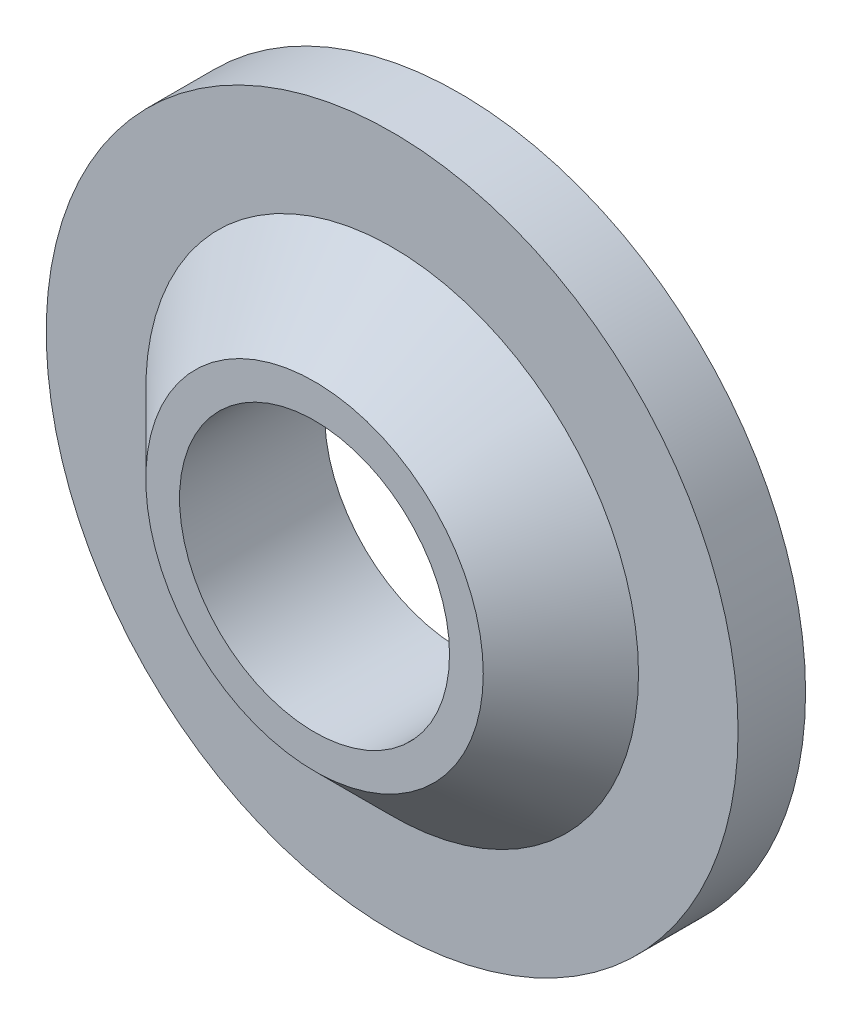
ISO-10303-21;
HEADER;
FILE_DESCRIPTION(('STEP AP214'),'2;1');
FILE_NAME('part.step','',(''),(''),'','','');
FILE_SCHEMA(('AUTOMOTIVE_DESIGN { 1 0 10303 214 1 1 1 1 }'));
ENDSEC;
DATA;
#1=APPLICATION_CONTEXT('core data for automotive mechanical design processes');
#2=APPLICATION_PROTOCOL_DEFINITION('international standard','automotive_design',2000,#1);
#3=PRODUCT_CONTEXT('',#1,'mechanical');
#4=PRODUCT('Part','Part','',(#3));
#5=PRODUCT_RELATED_PRODUCT_CATEGORY('part','',(#4));
#6=PRODUCT_DEFINITION_FORMATION('','',#4);
#7=PRODUCT_DEFINITION_CONTEXT('part definition',#1,'design');
#8=PRODUCT_DEFINITION('design','',#6,#7);
#9=PRODUCT_DEFINITION_SHAPE('','',#8);
#10=(LENGTH_UNIT() NAMED_UNIT(*) SI_UNIT(.MILLI.,.METRE.));
#11=(NAMED_UNIT(*) PLANE_ANGLE_UNIT() SI_UNIT($,.RADIAN.));
#12=(NAMED_UNIT(*) SI_UNIT($,.STERADIAN.) SOLID_ANGLE_UNIT());
#13=UNCERTAINTY_MEASURE_WITH_UNIT(LENGTH_MEASURE(1.E-05),#10,'distance_accuracy_value','');
#14=(GEOMETRIC_REPRESENTATION_CONTEXT(3) GLOBAL_UNCERTAINTY_ASSIGNED_CONTEXT((#13)) GLOBAL_UNIT_ASSIGNED_CONTEXT((#10,
#11,#12)) REPRESENTATION_CONTEXT('',''));
#15=CARTESIAN_POINT('',(0.,0.,0.));
#16=DIRECTION('',(0.,0.,1.));
#17=DIRECTION('',(1.,0.,0.));
#18=AXIS2_PLACEMENT_3D('',#15,#16,#17);
#19=CARTESIAN_POINT('',(0.,0.,37.8017124055555));
#20=DIRECTION('',(0.,0.,1.));
#21=DIRECTION('',(1.,0.,0.));
#22=AXIS2_PLACEMENT_3D('',#19,#20,#21);
#23=CYLINDRICAL_SURFACE('',#22,10.25);
#24=CARTESIAN_POINT('',(0.,0.,2.));
#25=DIRECTION('',(0.,0.,1.));
#26=DIRECTION('',(1.,0.,0.));
#27=AXIS2_PLACEMENT_3D('',#24,#25,#26);
#28=CIRCLE('',#27,10.25);
#29=CARTESIAN_POINT('',(10.25,0.,2.));
#30=VERTEX_POINT('',#29);
#31=EDGE_CURVE('E54',#30,#30,#28,.T.);
#32=ORIENTED_EDGE('',*,*,#31,.F.);
#33=EDGE_LOOP('',(#32));
#34=FACE_BOUND('',#33,.T.);
#35=CARTESIAN_POINT('',(0.,0.,0.));
#36=DIRECTION('',(0.,0.,1.));
#37=DIRECTION('',(1.,0.,0.));
#38=AXIS2_PLACEMENT_3D('',#35,#36,#37);
#39=CIRCLE('',#38,10.25);
#40=CARTESIAN_POINT('',(10.25,0.,0.));
#41=VERTEX_POINT('',#40);
#42=EDGE_CURVE('E10',#41,#41,#39,.T.);
#43=ORIENTED_EDGE('',*,*,#42,.T.);
#44=EDGE_LOOP('',(#43));
#45=FACE_BOUND('',#44,.T.);
#46=ADVANCED_FACE('F32',(#34,#45),#23,.T.);
#47=CARTESIAN_POINT('',(-10.25,0.,0.));
#48=DIRECTION('',(0.,0.,1.));
#49=DIRECTION('',(1.,0.,0.));
#50=AXIS2_PLACEMENT_3D('',#47,#48,#49);
#51=PLANE('',#50);
#52=ORIENTED_EDGE('',*,*,#42,.F.);
#53=EDGE_LOOP('',(#52));
#54=FACE_BOUND('',#53,.T.);
#55=CARTESIAN_POINT('',(0.,0.,0.));
#56=DIRECTION('',(0.,0.,1.));
#57=DIRECTION('',(1.,0.,0.));
#58=AXIS2_PLACEMENT_3D('',#55,#56,#57);
#59=CIRCLE('',#58,4.);
#60=CARTESIAN_POINT('',(4.,0.,0.));
#61=VERTEX_POINT('',#60);
#62=EDGE_CURVE('E38',#61,#61,#59,.T.);
#63=ORIENTED_EDGE('',*,*,#62,.T.);
#64=EDGE_LOOP('',(#63));
#65=FACE_BOUND('',#64,.T.);
#66=ADVANCED_FACE('F61',(#54,#65),#51,.F.);
#67=CARTESIAN_POINT('',(0.,0.,37.8017124055555));
#68=DIRECTION('',(0.,0.,1.));
#69=DIRECTION('',(1.,0.,0.));
#70=AXIS2_PLACEMENT_3D('',#67,#68,#69);
#71=CYLINDRICAL_SURFACE('',#70,4.);
#72=ORIENTED_EDGE('',*,*,#62,.F.);
#73=EDGE_LOOP('',(#72));
#74=FACE_BOUND('',#73,.T.);
#75=CARTESIAN_POINT('',(0.,0.,4.3));
#76=DIRECTION('',(0.,0.,1.));
#77=DIRECTION('',(1.,0.,0.));
#78=AXIS2_PLACEMENT_3D('',#75,#76,#77);
#79=CIRCLE('',#78,4.);
#80=CARTESIAN_POINT('',(4.,0.,4.3));
#81=VERTEX_POINT('',#80);
#82=EDGE_CURVE('E42',#81,#81,#79,.T.);
#83=ORIENTED_EDGE('',*,*,#82,.T.);
#84=EDGE_LOOP('',(#83));
#85=FACE_BOUND('',#84,.T.);
#86=ADVANCED_FACE('F65',(#74,#85),#71,.F.);
#87=CARTESIAN_POINT('',(-4.,0.,4.3));
#88=DIRECTION('',(0.,0.,-1.));
#89=DIRECTION('',(-1.,0.,0.));
#90=AXIS2_PLACEMENT_3D('',#87,#88,#89);
#91=PLANE('',#90);
#92=ORIENTED_EDGE('',*,*,#82,.F.);
#93=EDGE_LOOP('',(#92));
#94=FACE_BOUND('',#93,.T.);
#95=CARTESIAN_POINT('',(0.,0.,4.3));
#96=DIRECTION('',(0.,0.,1.));
#97=DIRECTION('',(1.,0.,0.));
#98=AXIS2_PLACEMENT_3D('',#95,#96,#97);
#99=CIRCLE('',#98,5.);
#100=CARTESIAN_POINT('',(5.,0.,4.3));
#101=VERTEX_POINT('',#100);
#102=EDGE_CURVE('E46',#101,#101,#99,.T.);
#103=ORIENTED_EDGE('',*,*,#102,.T.);
#104=EDGE_LOOP('',(#103));
#105=FACE_BOUND('',#104,.T.);
#106=ADVANCED_FACE('F70',(#94,#105),#91,.F.);
#107=CARTESIAN_POINT('',(0.,0.,2.));
#108=DIRECTION('',(0.,0.,-1.));
#109=DIRECTION('',(-1.,0.,0.));
#110=AXIS2_PLACEMENT_3D('',#107,#108,#109);
#111=CONICAL_SURFACE('',#110,7.29999999999999,0.785398163397447);
#112=ORIENTED_EDGE('',*,*,#102,.F.);
#113=EDGE_LOOP('',(#112));
#114=FACE_BOUND('',#113,.T.);
#115=CARTESIAN_POINT('',(0.,0.,2.));
#116=DIRECTION('',(0.,0.,1.));
#117=DIRECTION('',(1.,0.,0.));
#118=AXIS2_PLACEMENT_3D('',#115,#116,#117);
#119=CIRCLE('',#118,7.29999999999999);
#120=CARTESIAN_POINT('',(7.29999999999999,0.,2.));
#121=VERTEX_POINT('',#120);
#122=EDGE_CURVE('E51',#121,#121,#119,.T.);
#123=ORIENTED_EDGE('',*,*,#122,.T.);
#124=EDGE_LOOP('',(#123));
#125=FACE_BOUND('',#124,.T.);
#126=ADVANCED_FACE('F76',(#114,#125),#111,.T.);
#127=CARTESIAN_POINT('',(-7.29999999999999,0.,2.));
#128=DIRECTION('',(0.,0.,-1.));
#129=DIRECTION('',(-1.,0.,0.));
#130=AXIS2_PLACEMENT_3D('',#127,#128,#129);
#131=PLANE('',#130);
#132=ORIENTED_EDGE('',*,*,#122,.F.);
#133=EDGE_LOOP('',(#132));
#134=FACE_BOUND('',#133,.T.);
#135=ORIENTED_EDGE('',*,*,#31,.T.);
#136=EDGE_LOOP('',(#135));
#137=FACE_BOUND('',#136,.T.);
#138=ADVANCED_FACE('F58',(#134,#137),#131,.F.);
#139=CLOSED_SHELL('',(#46,#66,#86,#106,#126,#138));
#140=MANIFOLD_SOLID_BREP('B2',#139);
#141=ADVANCED_BREP_SHAPE_REPRESENTATION('',(#18,#140),#14);
#142=SHAPE_DEFINITION_REPRESENTATION(#9,#141);
ENDSEC;
END-ISO-10303-21;
